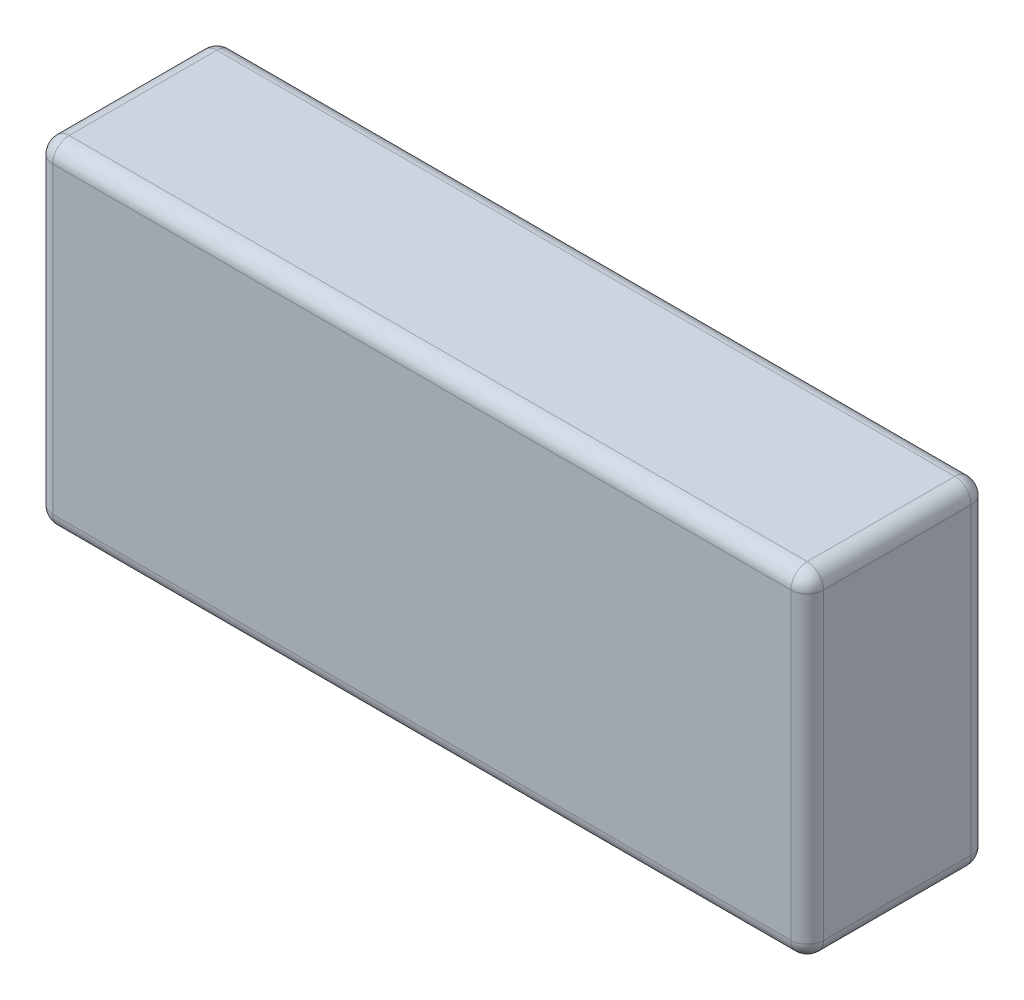
ISO-10303-21;
HEADER;
FILE_DESCRIPTION(('STEP AP214'),'2;1');
FILE_NAME('part.step','',(''),(''),'','','');
FILE_SCHEMA(('AUTOMOTIVE_DESIGN { 1 0 10303 214 1 1 1 1 }'));
ENDSEC;
DATA;
#1=APPLICATION_CONTEXT('core data for automotive mechanical design processes');
#2=APPLICATION_PROTOCOL_DEFINITION('international standard','automotive_design',2000,#1);
#3=PRODUCT_CONTEXT('',#1,'mechanical');
#4=PRODUCT('Part','Part','',(#3));
#5=PRODUCT_RELATED_PRODUCT_CATEGORY('part','',(#4));
#6=PRODUCT_DEFINITION_FORMATION('','',#4);
#7=PRODUCT_DEFINITION_CONTEXT('part definition',#1,'design');
#8=PRODUCT_DEFINITION('design','',#6,#7);
#9=PRODUCT_DEFINITION_SHAPE('','',#8);
#10=(LENGTH_UNIT() NAMED_UNIT(*) SI_UNIT(.MILLI.,.METRE.));
#11=(NAMED_UNIT(*) PLANE_ANGLE_UNIT() SI_UNIT($,.RADIAN.));
#12=(NAMED_UNIT(*) SI_UNIT($,.STERADIAN.) SOLID_ANGLE_UNIT());
#13=UNCERTAINTY_MEASURE_WITH_UNIT(LENGTH_MEASURE(1.E-05),#10,'distance_accuracy_value','');
#14=(GEOMETRIC_REPRESENTATION_CONTEXT(3) GLOBAL_UNCERTAINTY_ASSIGNED_CONTEXT((#13)) GLOBAL_UNIT_ASSIGNED_CONTEXT((#10,
#11,#12)) REPRESENTATION_CONTEXT('',''));
#15=CARTESIAN_POINT('',(0.,0.,0.));
#16=DIRECTION('',(0.,0.,1.));
#17=DIRECTION('',(1.,0.,0.));
#18=AXIS2_PLACEMENT_3D('',#15,#16,#17);
#19=CARTESIAN_POINT('',(32.9367731686848,27.5131578947368,22.));
#20=DIRECTION('',(-1.,0.,0.));
#21=DIRECTION('',(0.,0.,1.));
#22=AXIS2_PLACEMENT_3D('',#19,#20,#21);
#23=PLANE('',#22);
#24=DIRECTION('',(0.,0.,-1.));
#25=VECTOR('',#24,1.);
#26=CARTESIAN_POINT('',(32.9367731686848,-11.4868421052632,22.));
#27=LINE('',#26,#25);
#28=CARTESIAN_POINT('',(32.9367731686848,-11.4868421052632,20.));
#29=VERTEX_POINT('',#28);
#30=CARTESIAN_POINT('',(32.9367731686848,-11.4868421052632,2.));
#31=VERTEX_POINT('',#30);
#32=EDGE_CURVE('E154',#29,#31,#27,.T.);
#33=ORIENTED_EDGE('',*,*,#32,.T.);
#34=DIRECTION('',(0.,1.,0.));
#35=VECTOR('',#34,1.);
#36=CARTESIAN_POINT('',(32.9367731686848,27.5131578947368,2.));
#37=LINE('',#36,#35);
#38=CARTESIAN_POINT('',(32.9367731686848,25.5131578947368,2.));
#39=VERTEX_POINT('',#38);
#40=EDGE_CURVE('E231',#31,#39,#37,.T.);
#41=ORIENTED_EDGE('',*,*,#40,.T.);
#42=DIRECTION('',(0.,0.,-1.));
#43=VECTOR('',#42,1.);
#44=CARTESIAN_POINT('',(32.9367731686848,25.5131578947368,22.));
#45=LINE('',#44,#43);
#46=CARTESIAN_POINT('',(32.9367731686848,25.5131578947368,20.));
#47=VERTEX_POINT('',#46);
#48=EDGE_CURVE('E224',#39,#47,#45,.F.);
#49=ORIENTED_EDGE('',*,*,#48,.T.);
#50=DIRECTION('',(0.,1.,0.));
#51=VECTOR('',#50,1.);
#52=CARTESIAN_POINT('',(32.9367731686848,-13.4868421052632,20.));
#53=LINE('',#52,#51);
#54=EDGE_CURVE('E222',#47,#29,#53,.F.);
#55=ORIENTED_EDGE('',*,*,#54,.T.);
#56=EDGE_LOOP('',(#33,#41,#49,#55));
#57=FACE_BOUND('',#56,.T.);
#58=ADVANCED_FACE('F33',(#57),#23,.F.);
#59=CARTESIAN_POINT('',(-61.0632268313152,27.5131578947368,22.));
#60=DIRECTION('',(0.,-1.,0.));
#61=DIRECTION('',(0.,0.,-1.));
#62=AXIS2_PLACEMENT_3D('',#59,#60,#61);
#63=PLANE('',#62);
#64=DIRECTION('',(-1.,0.,0.));
#65=VECTOR('',#64,1.);
#66=CARTESIAN_POINT('',(-61.0632268313152,27.5131578947368,2.));
#67=LINE('',#66,#65);
#68=CARTESIAN_POINT('',(30.9367731686848,27.5131578947368,2.));
#69=VERTEX_POINT('',#68);
#70=CARTESIAN_POINT('',(-59.0632268313152,27.5131578947368,2.));
#71=VERTEX_POINT('',#70);
#72=EDGE_CURVE('E218',#69,#71,#67,.T.);
#73=ORIENTED_EDGE('',*,*,#72,.T.);
#74=DIRECTION('',(0.,0.,-1.));
#75=VECTOR('',#74,1.);
#76=CARTESIAN_POINT('',(-59.0632268313152,27.5131578947368,22.));
#77=LINE('',#76,#75);
#78=CARTESIAN_POINT('',(-59.0632268313152,27.5131578947368,20.));
#79=VERTEX_POINT('',#78);
#80=EDGE_CURVE('E215',#71,#79,#77,.F.);
#81=ORIENTED_EDGE('',*,*,#80,.T.);
#82=DIRECTION('',(-1.,0.,0.));
#83=VECTOR('',#82,1.);
#84=CARTESIAN_POINT('',(32.9367731686848,27.5131578947368,20.));
#85=LINE('',#84,#83);
#86=CARTESIAN_POINT('',(30.9367731686848,27.5131578947368,20.));
#87=VERTEX_POINT('',#86);
#88=EDGE_CURVE('E208',#79,#87,#85,.F.);
#89=ORIENTED_EDGE('',*,*,#88,.T.);
#90=DIRECTION('',(0.,0.,-1.));
#91=VECTOR('',#90,1.);
#92=CARTESIAN_POINT('',(30.9367731686848,27.5131578947368,22.));
#93=LINE('',#92,#91);
#94=EDGE_CURVE('E211',#87,#69,#93,.T.);
#95=ORIENTED_EDGE('',*,*,#94,.T.);
#96=EDGE_LOOP('',(#73,#81,#89,#95));
#97=FACE_BOUND('',#96,.T.);
#98=ADVANCED_FACE('F216',(#97),#63,.F.);
#99=CARTESIAN_POINT('',(-61.0632268313152,27.5131578947368,22.));
#100=DIRECTION('',(1.,0.,0.));
#101=DIRECTION('',(0.,1.,0.));
#102=AXIS2_PLACEMENT_3D('',#99,#100,#101);
#103=PLANE('',#102);
#104=DIRECTION('',(0.,-1.,0.));
#105=VECTOR('',#104,1.);
#106=CARTESIAN_POINT('',(-61.0632268313152,27.5131578947368,2.));
#107=LINE('',#106,#105);
#108=CARTESIAN_POINT('',(-61.0632268313152,25.5131578947368,2.));
#109=VERTEX_POINT('',#108);
#110=CARTESIAN_POINT('',(-61.0632268313152,-11.4868421052632,2.));
#111=VERTEX_POINT('',#110);
#112=EDGE_CURVE('E280',#109,#111,#107,.T.);
#113=ORIENTED_EDGE('',*,*,#112,.T.);
#114=DIRECTION('',(0.,0.,-1.));
#115=VECTOR('',#114,1.);
#116=CARTESIAN_POINT('',(-61.0632268313152,-11.4868421052632,22.));
#117=LINE('',#116,#115);
#118=CARTESIAN_POINT('',(-61.0632268313152,-11.4868421052632,20.));
#119=VERTEX_POINT('',#118);
#120=EDGE_CURVE('E212',#111,#119,#117,.F.);
#121=ORIENTED_EDGE('',*,*,#120,.T.);
#122=DIRECTION('',(0.,-1.,0.));
#123=VECTOR('',#122,1.);
#124=CARTESIAN_POINT('',(-61.0632268313152,27.5131578947368,20.));
#125=LINE('',#124,#123);
#126=CARTESIAN_POINT('',(-61.0632268313152,25.5131578947368,20.));
#127=VERTEX_POINT('',#126);
#128=EDGE_CURVE('E273',#119,#127,#125,.F.);
#129=ORIENTED_EDGE('',*,*,#128,.T.);
#130=DIRECTION('',(0.,0.,-1.));
#131=VECTOR('',#130,1.);
#132=CARTESIAN_POINT('',(-61.0632268313152,25.5131578947368,22.));
#133=LINE('',#132,#131);
#134=EDGE_CURVE('E275',#127,#109,#133,.T.);
#135=ORIENTED_EDGE('',*,*,#134,.T.);
#136=EDGE_LOOP('',(#113,#121,#129,#135));
#137=FACE_BOUND('',#136,.T.);
#138=ADVANCED_FACE('F305',(#137),#103,.F.);
#139=CARTESIAN_POINT('',(-61.0632268313152,-13.4868421052632,22.));
#140=DIRECTION('',(0.,1.,0.));
#141=DIRECTION('',(-1.,0.,0.));
#142=AXIS2_PLACEMENT_3D('',#139,#140,#141);
#143=PLANE('',#142);
#144=DIRECTION('',(0.,0.,-1.));
#145=VECTOR('',#144,1.);
#146=CARTESIAN_POINT('',(-59.0632268313152,-13.4868421052632,22.));
#147=LINE('',#146,#145);
#148=CARTESIAN_POINT('',(-59.0632268313152,-13.4868421052632,20.));
#149=VERTEX_POINT('',#148);
#150=CARTESIAN_POINT('',(-59.0632268313152,-13.4868421052632,2.));
#151=VERTEX_POINT('',#150);
#152=EDGE_CURVE('E132',#149,#151,#147,.T.);
#153=ORIENTED_EDGE('',*,*,#152,.T.);
#154=DIRECTION('',(1.,0.,0.));
#155=VECTOR('',#154,1.);
#156=CARTESIAN_POINT('',(-61.0632268313152,-13.4868421052632,2.));
#157=LINE('',#156,#155);
#158=CARTESIAN_POINT('',(30.9367731686848,-13.4868421052632,2.));
#159=VERTEX_POINT('',#158);
#160=EDGE_CURVE('E128',#151,#159,#157,.T.);
#161=ORIENTED_EDGE('',*,*,#160,.T.);
#162=DIRECTION('',(0.,0.,-1.));
#163=VECTOR('',#162,1.);
#164=CARTESIAN_POINT('',(30.9367731686848,-13.4868421052632,22.));
#165=LINE('',#164,#163);
#166=CARTESIAN_POINT('',(30.9367731686848,-13.4868421052632,20.));
#167=VERTEX_POINT('',#166);
#168=EDGE_CURVE('E122',#159,#167,#165,.F.);
#169=ORIENTED_EDGE('',*,*,#168,.T.);
#170=DIRECTION('',(1.,0.,0.));
#171=VECTOR('',#170,1.);
#172=CARTESIAN_POINT('',(-61.0632268313152,-13.4868421052632,20.));
#173=LINE('',#172,#171);
#174=EDGE_CURVE('E125',#167,#149,#173,.F.);
#175=ORIENTED_EDGE('',*,*,#174,.T.);
#176=EDGE_LOOP('',(#153,#161,#169,#175));
#177=FACE_BOUND('',#176,.T.);
#178=ADVANCED_FACE('F124',(#177),#143,.F.);
#179=CARTESIAN_POINT('',(0.,0.,22.));
#180=DIRECTION('',(0.,0.,1.));
#181=DIRECTION('',(1.,0.,0.));
#182=AXIS2_PLACEMENT_3D('',#179,#180,#181);
#183=PLANE('',#182);
#184=DIRECTION('',(0.,-1.,0.));
#185=VECTOR('',#184,1.);
#186=CARTESIAN_POINT('',(-59.0632268313152,-13.4868421052632,22.));
#187=LINE('',#186,#185);
#188=CARTESIAN_POINT('',(-59.0632268313152,25.5131578947368,22.));
#189=VERTEX_POINT('',#188);
#190=CARTESIAN_POINT('',(-59.0632268313152,-11.4868421052632,22.));
#191=VERTEX_POINT('',#190);
#192=EDGE_CURVE('E42',#189,#191,#187,.T.);
#193=ORIENTED_EDGE('',*,*,#192,.T.);
#194=DIRECTION('',(1.,0.,0.));
#195=VECTOR('',#194,1.);
#196=CARTESIAN_POINT('',(32.9367731686848,-11.4868421052632,22.));
#197=LINE('',#196,#195);
#198=CARTESIAN_POINT('',(30.9367731686848,-11.4868421052632,22.));
#199=VERTEX_POINT('',#198);
#200=EDGE_CURVE('E11',#191,#199,#197,.T.);
#201=ORIENTED_EDGE('',*,*,#200,.T.);
#202=DIRECTION('',(0.,1.,0.));
#203=VECTOR('',#202,1.);
#204=CARTESIAN_POINT('',(30.9367731686848,27.5131578947368,22.));
#205=LINE('',#204,#203);
#206=CARTESIAN_POINT('',(30.9367731686848,25.5131578947368,22.));
#207=VERTEX_POINT('',#206);
#208=EDGE_CURVE('E233',#199,#207,#205,.T.);
#209=ORIENTED_EDGE('',*,*,#208,.T.);
#210=DIRECTION('',(-1.,0.,0.));
#211=VECTOR('',#210,1.);
#212=CARTESIAN_POINT('',(-61.0632268313152,25.5131578947368,22.));
#213=LINE('',#212,#211);
#214=EDGE_CURVE('E53',#207,#189,#213,.T.);
#215=ORIENTED_EDGE('',*,*,#214,.T.);
#216=EDGE_LOOP('',(#193,#201,#209,#215));
#217=FACE_BOUND('',#216,.T.);
#218=ADVANCED_FACE('F483',(#217),#183,.T.);
#219=CARTESIAN_POINT('',(0.,0.,0.));
#220=DIRECTION('',(0.,0.,1.));
#221=DIRECTION('',(1.,0.,0.));
#222=AXIS2_PLACEMENT_3D('',#219,#220,#221);
#223=PLANE('',#222);
#224=DIRECTION('',(0.,1.,0.));
#225=VECTOR('',#224,1.);
#226=CARTESIAN_POINT('',(30.9367731686848,0.,0.));
#227=LINE('',#226,#225);
#228=CARTESIAN_POINT('',(30.9367731686848,25.5131578947368,0.));
#229=VERTEX_POINT('',#228);
#230=CARTESIAN_POINT('',(30.9367731686848,-11.4868421052632,0.));
#231=VERTEX_POINT('',#230);
#232=EDGE_CURVE('E269',#229,#231,#227,.F.);
#233=ORIENTED_EDGE('',*,*,#232,.T.);
#234=DIRECTION('',(1.,0.,0.));
#235=VECTOR('',#234,1.);
#236=CARTESIAN_POINT('',(0.,-11.4868421052632,0.));
#237=LINE('',#236,#235);
#238=CARTESIAN_POINT('',(-59.0632268313152,-11.4868421052632,0.));
#239=VERTEX_POINT('',#238);
#240=EDGE_CURVE('E263',#231,#239,#237,.F.);
#241=ORIENTED_EDGE('',*,*,#240,.T.);
#242=DIRECTION('',(0.,-1.,0.));
#243=VECTOR('',#242,1.);
#244=CARTESIAN_POINT('',(-59.0632268313152,0.,0.));
#245=LINE('',#244,#243);
#246=CARTESIAN_POINT('',(-59.0632268313152,25.5131578947368,0.));
#247=VERTEX_POINT('',#246);
#248=EDGE_CURVE('E257',#239,#247,#245,.F.);
#249=ORIENTED_EDGE('',*,*,#248,.T.);
#250=DIRECTION('',(-1.,0.,0.));
#251=VECTOR('',#250,1.);
#252=CARTESIAN_POINT('',(0.,25.5131578947368,0.));
#253=LINE('',#252,#251);
#254=EDGE_CURVE('E264',#247,#229,#253,.F.);
#255=ORIENTED_EDGE('',*,*,#254,.T.);
#256=EDGE_LOOP('',(#233,#241,#249,#255));
#257=FACE_BOUND('',#256,.T.);
#258=ADVANCED_FACE('F267',(#257),#223,.F.);
#259=CARTESIAN_POINT('',(0.,25.5131578947368,20.));
#260=DIRECTION('',(1.,0.,0.));
#261=DIRECTION('',(0.,0.,-1.));
#262=AXIS2_PLACEMENT_3D('',#259,#260,#261);
#263=CYLINDRICAL_SURFACE('',#262,2.);
#264=CARTESIAN_POINT('',(-59.0632268313152,25.5131578947368,20.));
#265=DIRECTION('',(-1.,0.,0.));
#266=DIRECTION('',(0.,0.,1.));
#267=AXIS2_PLACEMENT_3D('',#264,#265,#266);
#268=CIRCLE('',#267,2.);
#269=EDGE_CURVE('E37',#189,#79,#268,.T.);
#270=ORIENTED_EDGE('',*,*,#269,.F.);
#271=ORIENTED_EDGE('',*,*,#214,.F.);
#272=CARTESIAN_POINT('',(30.9367731686848,25.5131578947368,20.));
#273=DIRECTION('',(1.,0.,0.));
#274=DIRECTION('',(0.,0.,-1.));
#275=AXIS2_PLACEMENT_3D('',#272,#273,#274);
#276=CIRCLE('',#275,2.);
#277=EDGE_CURVE('E194',#87,#207,#276,.T.);
#278=ORIENTED_EDGE('',*,*,#277,.F.);
#279=ORIENTED_EDGE('',*,*,#88,.F.);
#280=EDGE_LOOP('',(#270,#271,#278,#279));
#281=FACE_BOUND('',#280,.T.);
#282=ADVANCED_FACE('F35',(#281),#263,.T.);
#283=CARTESIAN_POINT('',(-59.0632268313152,25.5131578947368,20.));
#284=DIRECTION('',(0.,0.,1.));
#285=DIRECTION('',(1.,0.,0.));
#286=AXIS2_PLACEMENT_3D('',#283,#284,#285);
#287=SPHERICAL_SURFACE('',#286,2.);
#288=CARTESIAN_POINT('',(-59.0632268313152,25.5131578947368,20.));
#289=DIRECTION('',(0.,1.,0.));
#290=DIRECTION('',(0.,0.,1.));
#291=AXIS2_PLACEMENT_3D('',#288,#289,#290);
#292=CIRCLE('',#291,2.);
#293=EDGE_CURVE('E190',#189,#127,#292,.F.);
#294=ORIENTED_EDGE('',*,*,#293,.F.);
#295=ORIENTED_EDGE('',*,*,#269,.T.);
#296=CARTESIAN_POINT('',(-59.0632268313152,25.5131578947368,20.));
#297=DIRECTION('',(0.,0.,1.));
#298=DIRECTION('',(1.,0.,0.));
#299=AXIS2_PLACEMENT_3D('',#296,#297,#298);
#300=CIRCLE('',#299,2.);
#301=EDGE_CURVE('E193',#127,#79,#300,.F.);
#302=ORIENTED_EDGE('',*,*,#301,.F.);
#303=EDGE_LOOP('',(#294,#295,#302));
#304=FACE_BOUND('',#303,.T.);
#305=ADVANCED_FACE('F205',(#304),#287,.T.);
#306=CARTESIAN_POINT('',(30.9367731686848,25.5131578947368,20.));
#307=DIRECTION('',(0.,0.,1.));
#308=DIRECTION('',(1.,0.,0.));
#309=AXIS2_PLACEMENT_3D('',#306,#307,#308);
#310=SPHERICAL_SURFACE('',#309,2.);
#311=CARTESIAN_POINT('',(30.9367731686848,25.5131578947368,20.));
#312=DIRECTION('',(0.,0.,1.));
#313=DIRECTION('',(1.,0.,0.));
#314=AXIS2_PLACEMENT_3D('',#311,#312,#313);
#315=CIRCLE('',#314,2.);
#316=EDGE_CURVE('E184',#87,#47,#315,.F.);
#317=ORIENTED_EDGE('',*,*,#316,.F.);
#318=ORIENTED_EDGE('',*,*,#277,.T.);
#319=CARTESIAN_POINT('',(30.9367731686848,25.5131578947368,20.));
#320=DIRECTION('',(0.,1.,0.));
#321=DIRECTION('',(0.,0.,1.));
#322=AXIS2_PLACEMENT_3D('',#319,#320,#321);
#323=CIRCLE('',#322,2.);
#324=EDGE_CURVE('E187',#47,#207,#323,.F.);
#325=ORIENTED_EDGE('',*,*,#324,.F.);
#326=EDGE_LOOP('',(#317,#318,#325));
#327=FACE_BOUND('',#326,.T.);
#328=ADVANCED_FACE('F456',(#327),#310,.T.);
#329=CARTESIAN_POINT('',(-59.0632268313152,25.5131578947368,22.));
#330=DIRECTION('',(0.,0.,-1.));
#331=DIRECTION('',(-1.,0.,0.));
#332=AXIS2_PLACEMENT_3D('',#329,#330,#331);
#333=CYLINDRICAL_SURFACE('',#332,2.);
#334=ORIENTED_EDGE('',*,*,#301,.T.);
#335=ORIENTED_EDGE('',*,*,#80,.F.);
#336=CARTESIAN_POINT('',(-59.0632268313152,25.5131578947368,2.));
#337=DIRECTION('',(0.,0.,-1.));
#338=DIRECTION('',(-1.,0.,0.));
#339=AXIS2_PLACEMENT_3D('',#336,#337,#338);
#340=CIRCLE('',#339,2.);
#341=EDGE_CURVE('E178',#109,#71,#340,.T.);
#342=ORIENTED_EDGE('',*,*,#341,.F.);
#343=ORIENTED_EDGE('',*,*,#134,.F.);
#344=EDGE_LOOP('',(#334,#335,#342,#343));
#345=FACE_BOUND('',#344,.T.);
#346=ADVANCED_FACE('F307',(#345),#333,.T.);
#347=CARTESIAN_POINT('',(-59.0632268313152,0.,20.));
#348=DIRECTION('',(0.,1.,0.));
#349=DIRECTION('',(-1.,0.,0.));
#350=AXIS2_PLACEMENT_3D('',#347,#348,#349);
#351=CYLINDRICAL_SURFACE('',#350,2.);
#352=ORIENTED_EDGE('',*,*,#293,.T.);
#353=ORIENTED_EDGE('',*,*,#128,.F.);
#354=CARTESIAN_POINT('',(-59.0632268313152,-11.4868421052632,20.));
#355=DIRECTION('',(0.,-1.,0.));
#356=DIRECTION('',(0.,0.,-1.));
#357=AXIS2_PLACEMENT_3D('',#354,#355,#356);
#358=CIRCLE('',#357,2.);
#359=EDGE_CURVE('E175',#191,#119,#358,.T.);
#360=ORIENTED_EDGE('',*,*,#359,.F.);
#361=ORIENTED_EDGE('',*,*,#192,.F.);
#362=EDGE_LOOP('',(#352,#353,#360,#361));
#363=FACE_BOUND('',#362,.T.);
#364=ADVANCED_FACE('F440',(#363),#351,.T.);
#365=CARTESIAN_POINT('',(0.,-11.4868421052632,20.));
#366=DIRECTION('',(-1.,0.,0.));
#367=DIRECTION('',(0.,-1.,0.));
#368=AXIS2_PLACEMENT_3D('',#365,#366,#367);
#369=CYLINDRICAL_SURFACE('',#368,2.);
#370=CARTESIAN_POINT('',(30.9367731686848,-11.4868421052632,20.));
#371=DIRECTION('',(1.,0.,0.));
#372=DIRECTION('',(0.,0.,-1.));
#373=AXIS2_PLACEMENT_3D('',#370,#371,#372);
#374=CIRCLE('',#373,2.);
#375=EDGE_CURVE('E138',#199,#167,#374,.T.);
#376=ORIENTED_EDGE('',*,*,#375,.F.);
#377=ORIENTED_EDGE('',*,*,#200,.F.);
#378=CARTESIAN_POINT('',(-59.0632268313152,-11.4868421052632,20.));
#379=DIRECTION('',(-1.,0.,0.));
#380=DIRECTION('',(0.,0.,1.));
#381=AXIS2_PLACEMENT_3D('',#378,#379,#380);
#382=CIRCLE('',#381,2.);
#383=EDGE_CURVE('E141',#149,#191,#382,.T.);
#384=ORIENTED_EDGE('',*,*,#383,.F.);
#385=ORIENTED_EDGE('',*,*,#174,.F.);
#386=EDGE_LOOP('',(#376,#377,#384,#385));
#387=FACE_BOUND('',#386,.T.);
#388=ADVANCED_FACE('F137',(#387),#369,.T.);
#389=CARTESIAN_POINT('',(30.9367731686848,0.,20.));
#390=DIRECTION('',(0.,-1.,0.));
#391=DIRECTION('',(0.,0.,-1.));
#392=AXIS2_PLACEMENT_3D('',#389,#390,#391);
#393=CYLINDRICAL_SURFACE('',#392,2.);
#394=ORIENTED_EDGE('',*,*,#324,.T.);
#395=ORIENTED_EDGE('',*,*,#208,.F.);
#396=CARTESIAN_POINT('',(30.9367731686848,-11.4868421052632,20.));
#397=DIRECTION('',(0.,-1.,0.));
#398=DIRECTION('',(0.,0.,-1.));
#399=AXIS2_PLACEMENT_3D('',#396,#397,#398);
#400=CIRCLE('',#399,2.);
#401=EDGE_CURVE('E150',#29,#199,#400,.T.);
#402=ORIENTED_EDGE('',*,*,#401,.F.);
#403=ORIENTED_EDGE('',*,*,#54,.F.);
#404=EDGE_LOOP('',(#394,#395,#402,#403));
#405=FACE_BOUND('',#404,.T.);
#406=ADVANCED_FACE('F424',(#405),#393,.T.);
#407=CARTESIAN_POINT('',(30.9367731686848,25.5131578947368,22.));
#408=DIRECTION('',(0.,0.,-1.));
#409=DIRECTION('',(-1.,0.,0.));
#410=AXIS2_PLACEMENT_3D('',#407,#408,#409);
#411=CYLINDRICAL_SURFACE('',#410,2.);
#412=ORIENTED_EDGE('',*,*,#316,.T.);
#413=ORIENTED_EDGE('',*,*,#48,.F.);
#414=CARTESIAN_POINT('',(30.9367731686848,25.5131578947368,2.));
#415=DIRECTION('',(0.,0.,-1.));
#416=DIRECTION('',(-1.,0.,0.));
#417=AXIS2_PLACEMENT_3D('',#414,#415,#416);
#418=CIRCLE('',#417,2.);
#419=EDGE_CURVE('E170',#69,#39,#418,.T.);
#420=ORIENTED_EDGE('',*,*,#419,.F.);
#421=ORIENTED_EDGE('',*,*,#94,.F.);
#422=EDGE_LOOP('',(#412,#413,#420,#421));
#423=FACE_BOUND('',#422,.T.);
#424=ADVANCED_FACE('F291',(#423),#411,.T.);
#425=CARTESIAN_POINT('',(-61.0632268313152,25.5131578947368,2.));
#426=DIRECTION('',(-1.,0.,0.));
#427=DIRECTION('',(0.,0.,1.));
#428=AXIS2_PLACEMENT_3D('',#425,#426,#427);
#429=CYLINDRICAL_SURFACE('',#428,2.);
#430=CARTESIAN_POINT('',(-59.0632268313152,25.5131578947368,2.));
#431=DIRECTION('',(-1.,0.,0.));
#432=DIRECTION('',(0.,0.,1.));
#433=AXIS2_PLACEMENT_3D('',#430,#431,#432);
#434=CIRCLE('',#433,2.);
#435=EDGE_CURVE('E181',#71,#247,#434,.T.);
#436=ORIENTED_EDGE('',*,*,#435,.F.);
#437=ORIENTED_EDGE('',*,*,#72,.F.);
#438=CARTESIAN_POINT('',(30.9367731686848,25.5131578947368,2.));
#439=DIRECTION('',(1.,0.,0.));
#440=DIRECTION('',(0.,0.,-1.));
#441=AXIS2_PLACEMENT_3D('',#438,#439,#440);
#442=CIRCLE('',#441,2.);
#443=EDGE_CURVE('E167',#229,#69,#442,.T.);
#444=ORIENTED_EDGE('',*,*,#443,.F.);
#445=ORIENTED_EDGE('',*,*,#254,.F.);
#446=EDGE_LOOP('',(#436,#437,#444,#445));
#447=FACE_BOUND('',#446,.T.);
#448=ADVANCED_FACE('F288',(#447),#429,.T.);
#449=CARTESIAN_POINT('',(-59.0632268313152,25.5131578947368,2.));
#450=DIRECTION('',(0.,0.,1.));
#451=DIRECTION('',(1.,0.,0.));
#452=AXIS2_PLACEMENT_3D('',#449,#450,#451);
#453=SPHERICAL_SURFACE('',#452,2.);
#454=ORIENTED_EDGE('',*,*,#341,.T.);
#455=ORIENTED_EDGE('',*,*,#435,.T.);
#456=CARTESIAN_POINT('',(-59.0632268313152,25.5131578947368,2.));
#457=DIRECTION('',(0.,1.,0.));
#458=DIRECTION('',(0.,0.,1.));
#459=AXIS2_PLACEMENT_3D('',#456,#457,#458);
#460=CIRCLE('',#459,2.);
#461=EDGE_CURVE('E158',#109,#247,#460,.F.);
#462=ORIENTED_EDGE('',*,*,#461,.F.);
#463=EDGE_LOOP('',(#454,#455,#462));
#464=FACE_BOUND('',#463,.T.);
#465=ADVANCED_FACE('F309',(#464),#453,.T.);
#466=CARTESIAN_POINT('',(-59.0632268313152,-11.4868421052632,20.));
#467=DIRECTION('',(0.,0.,1.));
#468=DIRECTION('',(1.,0.,0.));
#469=AXIS2_PLACEMENT_3D('',#466,#467,#468);
#470=SPHERICAL_SURFACE('',#469,2.);
#471=ORIENTED_EDGE('',*,*,#383,.T.);
#472=ORIENTED_EDGE('',*,*,#359,.T.);
#473=CARTESIAN_POINT('',(-59.0632268313152,-11.4868421052632,20.));
#474=DIRECTION('',(0.,0.,1.));
#475=DIRECTION('',(1.,0.,0.));
#476=AXIS2_PLACEMENT_3D('',#473,#474,#475);
#477=CIRCLE('',#476,2.);
#478=EDGE_CURVE('E155',#149,#119,#477,.F.);
#479=ORIENTED_EDGE('',*,*,#478,.F.);
#480=EDGE_LOOP('',(#471,#472,#479));
#481=FACE_BOUND('',#480,.T.);
#482=ADVANCED_FACE('F311',(#481),#470,.T.);
#483=CARTESIAN_POINT('',(30.9367731686848,-11.4868421052632,20.));
#484=DIRECTION('',(0.,0.,1.));
#485=DIRECTION('',(1.,0.,0.));
#486=AXIS2_PLACEMENT_3D('',#483,#484,#485);
#487=SPHERICAL_SURFACE('',#486,2.);
#488=ORIENTED_EDGE('',*,*,#401,.T.);
#489=ORIENTED_EDGE('',*,*,#375,.T.);
#490=CARTESIAN_POINT('',(30.9367731686848,-11.4868421052632,20.));
#491=DIRECTION('',(0.,0.,1.));
#492=DIRECTION('',(1.,0.,0.));
#493=AXIS2_PLACEMENT_3D('',#490,#491,#492);
#494=CIRCLE('',#493,2.);
#495=EDGE_CURVE('E147',#29,#167,#494,.F.);
#496=ORIENTED_EDGE('',*,*,#495,.F.);
#497=EDGE_LOOP('',(#488,#489,#496));
#498=FACE_BOUND('',#497,.T.);
#499=ADVANCED_FACE('F146',(#498),#487,.T.);
#500=CARTESIAN_POINT('',(30.9367731686848,25.5131578947368,2.));
#501=DIRECTION('',(0.,0.,1.));
#502=DIRECTION('',(1.,0.,0.));
#503=AXIS2_PLACEMENT_3D('',#500,#501,#502);
#504=SPHERICAL_SURFACE('',#503,2.);
#505=ORIENTED_EDGE('',*,*,#443,.T.);
#506=ORIENTED_EDGE('',*,*,#419,.T.);
#507=CARTESIAN_POINT('',(30.9367731686848,25.5131578947368,2.));
#508=DIRECTION('',(0.,1.,0.));
#509=DIRECTION('',(0.,0.,1.));
#510=AXIS2_PLACEMENT_3D('',#507,#508,#509);
#511=CIRCLE('',#510,2.);
#512=EDGE_CURVE('E156',#229,#39,#511,.F.);
#513=ORIENTED_EDGE('',*,*,#512,.F.);
#514=EDGE_LOOP('',(#505,#506,#513));
#515=FACE_BOUND('',#514,.T.);
#516=ADVANCED_FACE('F293',(#515),#504,.T.);
#517=CARTESIAN_POINT('',(-59.0632268313152,27.5131578947368,2.));
#518=DIRECTION('',(0.,-1.,0.));
#519=DIRECTION('',(1.,0.,0.));
#520=AXIS2_PLACEMENT_3D('',#517,#518,#519);
#521=CYLINDRICAL_SURFACE('',#520,2.);
#522=ORIENTED_EDGE('',*,*,#461,.T.);
#523=ORIENTED_EDGE('',*,*,#248,.F.);
#524=CARTESIAN_POINT('',(-59.0632268313152,-11.4868421052632,2.));
#525=DIRECTION('',(0.,-1.,0.));
#526=DIRECTION('',(0.,0.,-1.));
#527=AXIS2_PLACEMENT_3D('',#524,#525,#526);
#528=CIRCLE('',#527,2.);
#529=EDGE_CURVE('E161',#111,#239,#528,.T.);
#530=ORIENTED_EDGE('',*,*,#529,.F.);
#531=ORIENTED_EDGE('',*,*,#112,.F.);
#532=EDGE_LOOP('',(#522,#523,#530,#531));
#533=FACE_BOUND('',#532,.T.);
#534=ADVANCED_FACE('F259',(#533),#521,.T.);
#535=CARTESIAN_POINT('',(-59.0632268313152,-11.4868421052632,22.));
#536=DIRECTION('',(0.,0.,-1.));
#537=DIRECTION('',(-1.,0.,0.));
#538=AXIS2_PLACEMENT_3D('',#535,#536,#537);
#539=CYLINDRICAL_SURFACE('',#538,2.);
#540=ORIENTED_EDGE('',*,*,#478,.T.);
#541=ORIENTED_EDGE('',*,*,#120,.F.);
#542=CARTESIAN_POINT('',(-59.0632268313152,-11.4868421052632,2.));
#543=DIRECTION('',(0.,0.,-1.));
#544=DIRECTION('',(-1.,0.,0.));
#545=AXIS2_PLACEMENT_3D('',#542,#543,#544);
#546=CIRCLE('',#545,2.);
#547=EDGE_CURVE('E246',#151,#111,#546,.T.);
#548=ORIENTED_EDGE('',*,*,#547,.F.);
#549=ORIENTED_EDGE('',*,*,#152,.F.);
#550=EDGE_LOOP('',(#540,#541,#548,#549));
#551=FACE_BOUND('',#550,.T.);
#552=ADVANCED_FACE('F303',(#551),#539,.T.);
#553=CARTESIAN_POINT('',(30.9367731686848,-11.4868421052632,22.));
#554=DIRECTION('',(0.,0.,-1.));
#555=DIRECTION('',(-1.,0.,0.));
#556=AXIS2_PLACEMENT_3D('',#553,#554,#555);
#557=CYLINDRICAL_SURFACE('',#556,2.);
#558=ORIENTED_EDGE('',*,*,#495,.T.);
#559=ORIENTED_EDGE('',*,*,#168,.F.);
#560=CARTESIAN_POINT('',(30.9367731686848,-11.4868421052632,2.));
#561=DIRECTION('',(0.,0.,-1.));
#562=DIRECTION('',(-1.,0.,0.));
#563=AXIS2_PLACEMENT_3D('',#560,#561,#562);
#564=CIRCLE('',#563,2.);
#565=EDGE_CURVE('E243',#31,#159,#564,.T.);
#566=ORIENTED_EDGE('',*,*,#565,.F.);
#567=ORIENTED_EDGE('',*,*,#32,.F.);
#568=EDGE_LOOP('',(#558,#559,#566,#567));
#569=FACE_BOUND('',#568,.T.);
#570=ADVANCED_FACE('F152',(#569),#557,.T.);
#571=CARTESIAN_POINT('',(30.9367731686848,27.5131578947368,2.));
#572=DIRECTION('',(0.,1.,0.));
#573=DIRECTION('',(0.,0.,1.));
#574=AXIS2_PLACEMENT_3D('',#571,#572,#573);
#575=CYLINDRICAL_SURFACE('',#574,2.);
#576=ORIENTED_EDGE('',*,*,#512,.T.);
#577=ORIENTED_EDGE('',*,*,#40,.F.);
#578=CARTESIAN_POINT('',(30.9367731686848,-11.4868421052632,2.));
#579=DIRECTION('',(0.,-1.,0.));
#580=DIRECTION('',(1.,0.,0.));
#581=AXIS2_PLACEMENT_3D('',#578,#579,#580);
#582=CIRCLE('',#581,2.);
#583=EDGE_CURVE('E241',#231,#31,#582,.T.);
#584=ORIENTED_EDGE('',*,*,#583,.F.);
#585=ORIENTED_EDGE('',*,*,#232,.F.);
#586=EDGE_LOOP('',(#576,#577,#584,#585));
#587=FACE_BOUND('',#586,.T.);
#588=ADVANCED_FACE('F296',(#587),#575,.T.);
#589=CARTESIAN_POINT('',(-59.0632268313152,-11.4868421052632,2.));
#590=DIRECTION('',(0.,0.,1.));
#591=DIRECTION('',(1.,0.,0.));
#592=AXIS2_PLACEMENT_3D('',#589,#590,#591);
#593=SPHERICAL_SURFACE('',#592,2.);
#594=ORIENTED_EDGE('',*,*,#547,.T.);
#595=ORIENTED_EDGE('',*,*,#529,.T.);
#596=CARTESIAN_POINT('',(-59.0632268313152,-11.4868421052632,2.));
#597=DIRECTION('',(-1.,0.,0.));
#598=DIRECTION('',(0.,0.,1.));
#599=AXIS2_PLACEMENT_3D('',#596,#597,#598);
#600=CIRCLE('',#599,2.);
#601=EDGE_CURVE('E239',#151,#239,#600,.F.);
#602=ORIENTED_EDGE('',*,*,#601,.F.);
#603=EDGE_LOOP('',(#594,#595,#602));
#604=FACE_BOUND('',#603,.T.);
#605=ADVANCED_FACE('F253',(#604),#593,.T.);
#606=CARTESIAN_POINT('',(30.9367731686848,-11.4868421052632,2.));
#607=DIRECTION('',(0.,0.,1.));
#608=DIRECTION('',(1.,0.,0.));
#609=AXIS2_PLACEMENT_3D('',#606,#607,#608);
#610=SPHERICAL_SURFACE('',#609,2.);
#611=ORIENTED_EDGE('',*,*,#583,.T.);
#612=ORIENTED_EDGE('',*,*,#565,.T.);
#613=CARTESIAN_POINT('',(30.9367731686848,-11.4868421052632,2.));
#614=DIRECTION('',(1.,0.,0.));
#615=DIRECTION('',(0.,0.,-1.));
#616=AXIS2_PLACEMENT_3D('',#613,#614,#615);
#617=CIRCLE('',#616,2.);
#618=EDGE_CURVE('E237',#231,#159,#617,.F.);
#619=ORIENTED_EDGE('',*,*,#618,.F.);
#620=EDGE_LOOP('',(#611,#612,#619));
#621=FACE_BOUND('',#620,.T.);
#622=ADVANCED_FACE('F332',(#621),#610,.T.);
#623=CARTESIAN_POINT('',(-61.0632268313152,-11.4868421052632,2.));
#624=DIRECTION('',(1.,0.,0.));
#625=DIRECTION('',(0.,1.,0.));
#626=AXIS2_PLACEMENT_3D('',#623,#624,#625);
#627=CYLINDRICAL_SURFACE('',#626,2.);
#628=ORIENTED_EDGE('',*,*,#601,.T.);
#629=ORIENTED_EDGE('',*,*,#240,.F.);
#630=ORIENTED_EDGE('',*,*,#618,.T.);
#631=ORIENTED_EDGE('',*,*,#160,.F.);
#632=EDGE_LOOP('',(#628,#629,#630,#631));
#633=FACE_BOUND('',#632,.T.);
#634=ADVANCED_FACE('F329',(#633),#627,.T.);
#635=CLOSED_SHELL('',(#58,#98,#138,#178,#218,#258,#282,#305,#328,#346,#364,#388,#406,#424,#448,
#465,#482,#499,#516,#534,#552,#570,#588,#605,#622,#634));
#636=MANIFOLD_SOLID_BREP('B2',#635);
#637=ADVANCED_BREP_SHAPE_REPRESENTATION('',(#18,#636),#14);
#638=SHAPE_DEFINITION_REPRESENTATION(#9,#637);
ENDSEC;
END-ISO-10303-21;
